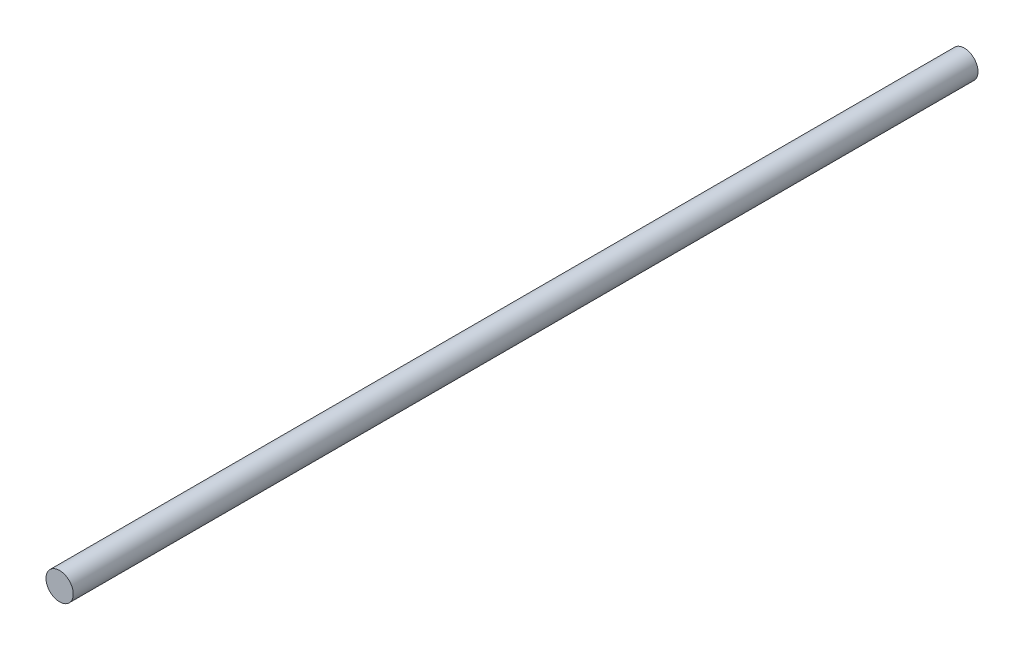
ISO-10303-21;
HEADER;
FILE_DESCRIPTION(('STEP AP214'),'2;1');
FILE_NAME('part.step','',(''),(''),'','','');
FILE_SCHEMA(('AUTOMOTIVE_DESIGN { 1 0 10303 214 1 1 1 1 }'));
ENDSEC;
DATA;
#1=APPLICATION_CONTEXT('core data for automotive mechanical design processes');
#2=APPLICATION_PROTOCOL_DEFINITION('international standard','automotive_design',2000,#1);
#3=PRODUCT_CONTEXT('',#1,'mechanical');
#4=PRODUCT('Part','Part','',(#3));
#5=PRODUCT_RELATED_PRODUCT_CATEGORY('part','',(#4));
#6=PRODUCT_DEFINITION_FORMATION('','',#4);
#7=PRODUCT_DEFINITION_CONTEXT('part definition',#1,'design');
#8=PRODUCT_DEFINITION('design','',#6,#7);
#9=PRODUCT_DEFINITION_SHAPE('','',#8);
#10=(LENGTH_UNIT() NAMED_UNIT(*) SI_UNIT(.MILLI.,.METRE.));
#11=(NAMED_UNIT(*) PLANE_ANGLE_UNIT() SI_UNIT($,.RADIAN.));
#12=(NAMED_UNIT(*) SI_UNIT($,.STERADIAN.) SOLID_ANGLE_UNIT());
#13=UNCERTAINTY_MEASURE_WITH_UNIT(LENGTH_MEASURE(1.E-05),#10,'distance_accuracy_value','');
#14=(GEOMETRIC_REPRESENTATION_CONTEXT(3) GLOBAL_UNCERTAINTY_ASSIGNED_CONTEXT((#13)) GLOBAL_UNIT_ASSIGNED_CONTEXT((#10,
#11,#12)) REPRESENTATION_CONTEXT('',''));
#15=CARTESIAN_POINT('',(0.,0.,0.));
#16=DIRECTION('',(0.,0.,1.));
#17=DIRECTION('',(1.,0.,0.));
#18=AXIS2_PLACEMENT_3D('',#15,#16,#17);
#19=CARTESIAN_POINT('',(0.,0.,210.82));
#20=DIRECTION('',(0.,0.,-1.));
#21=DIRECTION('',(-1.,0.,0.));
#22=AXIS2_PLACEMENT_3D('',#19,#20,#21);
#23=CYLINDRICAL_SURFACE('',#22,3.175);
#24=CARTESIAN_POINT('',(0.,0.,210.82));
#25=DIRECTION('',(0.,0.,1.));
#26=DIRECTION('',(1.,0.,0.));
#27=AXIS2_PLACEMENT_3D('',#24,#25,#26);
#28=CIRCLE('',#27,3.175);
#29=CARTESIAN_POINT('',(3.175,0.,210.82));
#30=VERTEX_POINT('',#29);
#31=EDGE_CURVE('E10',#30,#30,#28,.T.);
#32=ORIENTED_EDGE('',*,*,#31,.F.);
#33=EDGE_LOOP('',(#32));
#34=FACE_BOUND('',#33,.T.);
#35=CARTESIAN_POINT('',(0.,0.,0.));
#36=DIRECTION('',(0.,0.,1.));
#37=DIRECTION('',(1.,0.,0.));
#38=AXIS2_PLACEMENT_3D('',#35,#36,#37);
#39=CIRCLE('',#38,3.175);
#40=CARTESIAN_POINT('',(3.175,0.,0.));
#41=VERTEX_POINT('',#40);
#42=EDGE_CURVE('E38',#41,#41,#39,.T.);
#43=ORIENTED_EDGE('',*,*,#42,.T.);
#44=EDGE_LOOP('',(#43));
#45=FACE_BOUND('',#44,.T.);
#46=ADVANCED_FACE('F35',(#34,#45),#23,.T.);
#47=CARTESIAN_POINT('',(0.,0.,210.82));
#48=DIRECTION('',(0.,0.,1.));
#49=DIRECTION('',(1.,0.,0.));
#50=AXIS2_PLACEMENT_3D('',#47,#48,#49);
#51=PLANE('',#50);
#52=ORIENTED_EDGE('',*,*,#31,.T.);
#53=EDGE_LOOP('',(#52));
#54=FACE_BOUND('',#53,.T.);
#55=ADVANCED_FACE('F50',(#54),#51,.T.);
#56=CARTESIAN_POINT('',(0.,0.,0.));
#57=DIRECTION('',(0.,0.,1.));
#58=DIRECTION('',(1.,0.,0.));
#59=AXIS2_PLACEMENT_3D('',#56,#57,#58);
#60=PLANE('',#59);
#61=ORIENTED_EDGE('',*,*,#42,.F.);
#62=EDGE_LOOP('',(#61));
#63=FACE_BOUND('',#62,.T.);
#64=ADVANCED_FACE('F48',(#63),#60,.F.);
#65=CLOSED_SHELL('',(#46,#55,#64));
#66=MANIFOLD_SOLID_BREP('B2',#65);
#67=ADVANCED_BREP_SHAPE_REPRESENTATION('',(#18,#66),#14);
#68=SHAPE_DEFINITION_REPRESENTATION(#9,#67);
ENDSEC;
END-ISO-10303-21;
